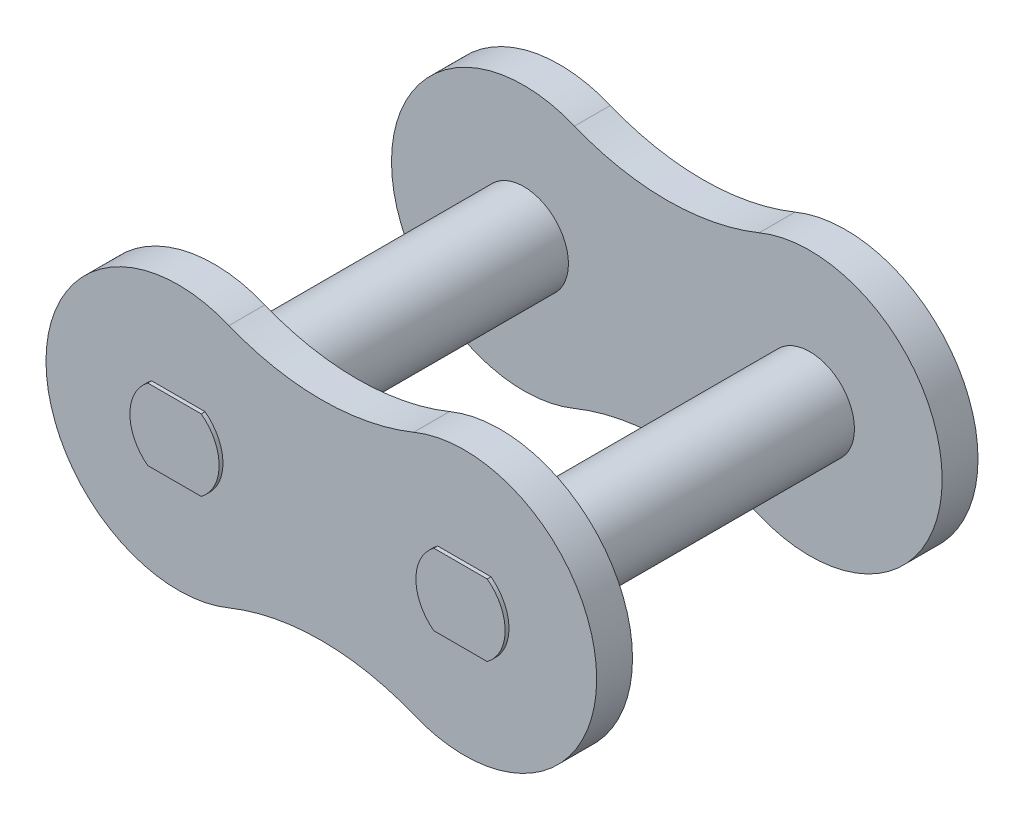
ISO-10303-21;
HEADER;
FILE_DESCRIPTION(('STEP AP214'),'2;1');
FILE_NAME('part.step','',(''),(''),'','','');
FILE_SCHEMA(('AUTOMOTIVE_DESIGN { 1 0 10303 214 1 1 1 1 }'));
ENDSEC;
DATA;
#1=APPLICATION_CONTEXT('core data for automotive mechanical design processes');
#2=APPLICATION_PROTOCOL_DEFINITION('international standard','automotive_design',2000,#1);
#3=PRODUCT_CONTEXT('',#1,'mechanical');
#4=PRODUCT('Part','Part','',(#3));
#5=PRODUCT_RELATED_PRODUCT_CATEGORY('part','',(#4));
#6=PRODUCT_DEFINITION_FORMATION('','',#4);
#7=PRODUCT_DEFINITION_CONTEXT('part definition',#1,'design');
#8=PRODUCT_DEFINITION('design','',#6,#7);
#9=PRODUCT_DEFINITION_SHAPE('','',#8);
#10=(LENGTH_UNIT() NAMED_UNIT(*) SI_UNIT(.MILLI.,.METRE.));
#11=(NAMED_UNIT(*) PLANE_ANGLE_UNIT() SI_UNIT($,.RADIAN.));
#12=(NAMED_UNIT(*) SI_UNIT($,.STERADIAN.) SOLID_ANGLE_UNIT());
#13=UNCERTAINTY_MEASURE_WITH_UNIT(LENGTH_MEASURE(1.E-05),#10,'distance_accuracy_value','');
#14=(GEOMETRIC_REPRESENTATION_CONTEXT(3) GLOBAL_UNCERTAINTY_ASSIGNED_CONTEXT((#13)) GLOBAL_UNIT_ASSIGNED_CONTEXT((#10,
#11,#12)) REPRESENTATION_CONTEXT('',''));
#15=CARTESIAN_POINT('',(0.,0.,0.));
#16=DIRECTION('',(0.,0.,1.));
#17=DIRECTION('',(1.,0.,0.));
#18=AXIS2_PLACEMENT_3D('',#15,#16,#17);
#19=CARTESIAN_POINT('',(0.,0.,0.));
#20=DIRECTION('',(0.,0.,1.));
#21=DIRECTION('',(1.,0.,0.));
#22=AXIS2_PLACEMENT_3D('',#19,#20,#21);
#23=PLANE('',#22);
#24=CARTESIAN_POINT('',(9.525,0.,0.));
#25=DIRECTION('',(0.,0.,1.));
#26=DIRECTION('',(1.,0.,0.));
#27=AXIS2_PLACEMENT_3D('',#24,#25,#26);
#28=CIRCLE('',#27,8.8138);
#29=CARTESIAN_POINT('',(6.15210476381968,-8.14288942364761,0.));
#30=VERTEX_POINT('',#29);
#31=CARTESIAN_POINT('',(6.15210476381968,8.14288942364761,0.));
#32=VERTEX_POINT('',#31);
#33=EDGE_CURVE('E352',#30,#32,#28,.T.);
#34=ORIENTED_EDGE('',*,*,#33,.F.);
#35=CARTESIAN_POINT('',(0.,-23.3328623999607,0.));
#36=DIRECTION('',(0.,0.,1.));
#37=DIRECTION('',(1.,0.,0.));
#38=AXIS2_PLACEMENT_3D('',#35,#36,#37);
#39=CIRCLE('',#38,16.3885225705716);
#40=CARTESIAN_POINT('',(-6.15210476382064,-8.14288942364801,0.));
#41=VERTEX_POINT('',#40);
#42=EDGE_CURVE('E357',#30,#41,#39,.T.);
#43=ORIENTED_EDGE('',*,*,#42,.T.);
#44=CARTESIAN_POINT('',(-9.525,0.,0.));
#45=DIRECTION('',(0.,0.,1.));
#46=DIRECTION('',(1.,0.,0.));
#47=AXIS2_PLACEMENT_3D('',#44,#45,#46);
#48=CIRCLE('',#47,8.8138);
#49=CARTESIAN_POINT('',(-6.15210476382064,8.14288942364801,0.));
#50=VERTEX_POINT('',#49);
#51=EDGE_CURVE('E375',#50,#41,#48,.T.);
#52=ORIENTED_EDGE('',*,*,#51,.F.);
#53=CARTESIAN_POINT('',(0.,23.3328623999607,0.));
#54=DIRECTION('',(0.,0.,1.));
#55=DIRECTION('',(1.,0.,0.));
#56=AXIS2_PLACEMENT_3D('',#53,#54,#55);
#57=CIRCLE('',#56,16.3885225705716);
#58=EDGE_CURVE('E373',#32,#50,#57,.F.);
#59=ORIENTED_EDGE('',*,*,#58,.F.);
#60=EDGE_LOOP('',(#34,#43,#52,#59));
#61=FACE_BOUND('',#60,.T.);
#62=CARTESIAN_POINT('',(-9.525,0.,0.));
#63=DIRECTION('',(0.,0.,1.));
#64=DIRECTION('',(1.,0.,0.));
#65=AXIS2_PLACEMENT_3D('',#62,#63,#64);
#66=CIRCLE('',#65,2.9718);
#67=CARTESIAN_POINT('',(-7.74701133932187,-2.38125,0.));
#68=VERTEX_POINT('',#67);
#69=CARTESIAN_POINT('',(-7.74701133932187,2.38125,0.));
#70=VERTEX_POINT('',#69);
#71=EDGE_CURVE('E246',#68,#70,#66,.T.);
#72=ORIENTED_EDGE('',*,*,#71,.T.);
#73=DIRECTION('',(-1.,0.,0.));
#74=VECTOR('',#73,1.);
#75=CARTESIAN_POINT('',(0.,2.38125,0.));
#76=LINE('',#75,#74);
#77=CARTESIAN_POINT('',(-11.3029886606781,2.38125,0.));
#78=VERTEX_POINT('',#77);
#79=EDGE_CURVE('E217',#70,#78,#76,.T.);
#80=ORIENTED_EDGE('',*,*,#79,.T.);
#81=CARTESIAN_POINT('',(-11.3029886606781,-2.38125,0.));
#82=VERTEX_POINT('',#81);
#83=EDGE_CURVE('E238',#78,#82,#66,.T.);
#84=ORIENTED_EDGE('',*,*,#83,.T.);
#85=DIRECTION('',(-1.,0.,0.));
#86=VECTOR('',#85,1.);
#87=CARTESIAN_POINT('',(0.,-2.38125,0.));
#88=LINE('',#87,#86);
#89=EDGE_CURVE('E57',#68,#82,#88,.T.);
#90=ORIENTED_EDGE('',*,*,#89,.F.);
#91=EDGE_LOOP('',(#72,#80,#84,#90));
#92=FACE_BOUND('',#91,.T.);
#93=DIRECTION('',(1.,0.,0.));
#94=VECTOR('',#93,1.);
#95=CARTESIAN_POINT('',(0.,2.38125,0.));
#96=LINE('',#95,#94);
#97=CARTESIAN_POINT('',(7.74701133932187,2.38125,0.));
#98=VERTEX_POINT('',#97);
#99=CARTESIAN_POINT('',(11.3029886606781,2.38125,0.));
#100=VERTEX_POINT('',#99);
#101=EDGE_CURVE('E213',#98,#100,#96,.T.);
#102=ORIENTED_EDGE('',*,*,#101,.F.);
#103=CARTESIAN_POINT('',(9.525,0.,0.));
#104=DIRECTION('',(0.,0.,1.));
#105=DIRECTION('',(1.,0.,0.));
#106=AXIS2_PLACEMENT_3D('',#103,#104,#105);
#107=CIRCLE('',#106,2.9718);
#108=CARTESIAN_POINT('',(7.74701133932187,-2.38125,0.));
#109=VERTEX_POINT('',#108);
#110=EDGE_CURVE('E207',#98,#109,#107,.T.);
#111=ORIENTED_EDGE('',*,*,#110,.T.);
#112=DIRECTION('',(1.,0.,0.));
#113=VECTOR('',#112,1.);
#114=CARTESIAN_POINT('',(0.,-2.38125,0.));
#115=LINE('',#114,#113);
#116=CARTESIAN_POINT('',(11.3029886606781,-2.38125,0.));
#117=VERTEX_POINT('',#116);
#118=EDGE_CURVE('E49',#109,#117,#115,.T.);
#119=ORIENTED_EDGE('',*,*,#118,.T.);
#120=EDGE_CURVE('E776',#117,#100,#107,.T.);
#121=ORIENTED_EDGE('',*,*,#120,.T.);
#122=EDGE_LOOP('',(#102,#111,#119,#121));
#123=FACE_BOUND('',#122,.T.);
#124=ADVANCED_FACE('F33',(#61,#92,#123),#23,.F.);
#125=CARTESIAN_POINT('',(-9.525,0.,25.4));
#126=DIRECTION('',(0.,0.,-1.));
#127=DIRECTION('',(-1.,0.,0.));
#128=AXIS2_PLACEMENT_3D('',#125,#126,#127);
#129=PLANE('',#128);
#130=CARTESIAN_POINT('',(9.525,0.,25.4));
#131=DIRECTION('',(0.,0.,1.));
#132=DIRECTION('',(1.,0.,0.));
#133=AXIS2_PLACEMENT_3D('',#130,#131,#132);
#134=CIRCLE('',#133,2.9718);
#135=CARTESIAN_POINT('',(7.74701133932187,2.38125,25.4));
#136=VERTEX_POINT('',#135);
#137=CARTESIAN_POINT('',(7.74701133932187,-2.38125,25.4));
#138=VERTEX_POINT('',#137);
#139=EDGE_CURVE('E269',#136,#138,#134,.T.);
#140=ORIENTED_EDGE('',*,*,#139,.F.);
#141=DIRECTION('',(1.,0.,0.));
#142=VECTOR('',#141,1.);
#143=CARTESIAN_POINT('',(0.,2.38125,25.4));
#144=LINE('',#143,#142);
#145=CARTESIAN_POINT('',(11.3029886606781,2.38125,25.4));
#146=VERTEX_POINT('',#145);
#147=EDGE_CURVE('E258',#136,#146,#144,.T.);
#148=ORIENTED_EDGE('',*,*,#147,.T.);
#149=CARTESIAN_POINT('',(11.3029886606781,-2.38125,25.4));
#150=VERTEX_POINT('',#149);
#151=EDGE_CURVE('E263',#150,#146,#134,.T.);
#152=ORIENTED_EDGE('',*,*,#151,.F.);
#153=DIRECTION('',(1.,0.,0.));
#154=VECTOR('',#153,1.);
#155=CARTESIAN_POINT('',(0.,-2.38125,25.4));
#156=LINE('',#155,#154);
#157=EDGE_CURVE('E272',#138,#150,#156,.T.);
#158=ORIENTED_EDGE('',*,*,#157,.F.);
#159=EDGE_LOOP('',(#140,#148,#152,#158));
#160=FACE_BOUND('',#159,.T.);
#161=CARTESIAN_POINT('',(0.,-23.3328623999607,25.4));
#162=DIRECTION('',(0.,0.,-1.));
#163=DIRECTION('',(1.,0.,0.));
#164=AXIS2_PLACEMENT_3D('',#161,#162,#163);
#165=CIRCLE('',#164,16.3885225705716);
#166=CARTESIAN_POINT('',(-6.15210476382064,-8.14288942364801,25.4));
#167=VERTEX_POINT('',#166);
#168=CARTESIAN_POINT('',(6.15210476381968,-8.14288942364761,25.4));
#169=VERTEX_POINT('',#168);
#170=EDGE_CURVE('E317',#167,#169,#165,.T.);
#171=ORIENTED_EDGE('',*,*,#170,.T.);
#172=CARTESIAN_POINT('',(9.525,0.,25.4));
#173=DIRECTION('',(0.,0.,1.));
#174=DIRECTION('',(1.,0.,0.));
#175=AXIS2_PLACEMENT_3D('',#172,#173,#174);
#176=CIRCLE('',#175,8.8138);
#177=CARTESIAN_POINT('',(6.15210476381967,8.1428894236476,25.4));
#178=VERTEX_POINT('',#177);
#179=EDGE_CURVE('E334',#169,#178,#176,.T.);
#180=ORIENTED_EDGE('',*,*,#179,.T.);
#181=CARTESIAN_POINT('',(0.,23.3328623999607,25.4));
#182=DIRECTION('',(0.,0.,-1.));
#183=DIRECTION('',(1.,0.,0.));
#184=AXIS2_PLACEMENT_3D('',#181,#182,#183);
#185=CIRCLE('',#184,16.3885225705716);
#186=CARTESIAN_POINT('',(-6.15210476382064,8.14288942364801,25.4));
#187=VERTEX_POINT('',#186);
#188=EDGE_CURVE('E337',#178,#187,#185,.T.);
#189=ORIENTED_EDGE('',*,*,#188,.T.);
#190=CARTESIAN_POINT('',(-9.525,0.,25.4));
#191=DIRECTION('',(0.,0.,1.));
#192=DIRECTION('',(1.,0.,0.));
#193=AXIS2_PLACEMENT_3D('',#190,#191,#192);
#194=CIRCLE('',#193,8.8138);
#195=EDGE_CURVE('E322',#187,#167,#194,.T.);
#196=ORIENTED_EDGE('',*,*,#195,.T.);
#197=EDGE_LOOP('',(#171,#180,#189,#196));
#198=FACE_BOUND('',#197,.T.);
#199=DIRECTION('',(-1.,0.,0.));
#200=VECTOR('',#199,1.);
#201=CARTESIAN_POINT('',(0.,2.38125,25.4));
#202=LINE('',#201,#200);
#203=CARTESIAN_POINT('',(-7.74701133932187,2.38125,25.4));
#204=VERTEX_POINT('',#203);
#205=CARTESIAN_POINT('',(-11.3029886606781,2.38125,25.4));
#206=VERTEX_POINT('',#205);
#207=EDGE_CURVE('E287',#204,#206,#202,.T.);
#208=ORIENTED_EDGE('',*,*,#207,.F.);
#209=CARTESIAN_POINT('',(-9.525,0.,25.4));
#210=DIRECTION('',(0.,0.,1.));
#211=DIRECTION('',(1.,0.,0.));
#212=AXIS2_PLACEMENT_3D('',#209,#210,#211);
#213=CIRCLE('',#212,2.9718);
#214=CARTESIAN_POINT('',(-7.74701133932187,-2.38125,25.4));
#215=VERTEX_POINT('',#214);
#216=EDGE_CURVE('E292',#215,#204,#213,.T.);
#217=ORIENTED_EDGE('',*,*,#216,.F.);
#218=DIRECTION('',(-1.,0.,0.));
#219=VECTOR('',#218,1.);
#220=CARTESIAN_POINT('',(0.,-2.38125,25.4));
#221=LINE('',#220,#219);
#222=CARTESIAN_POINT('',(-11.3029886606781,-2.38125,25.4));
#223=VERTEX_POINT('',#222);
#224=EDGE_CURVE('E303',#215,#223,#221,.T.);
#225=ORIENTED_EDGE('',*,*,#224,.T.);
#226=EDGE_CURVE('E300',#206,#223,#213,.T.);
#227=ORIENTED_EDGE('',*,*,#226,.F.);
#228=EDGE_LOOP('',(#208,#217,#225,#227));
#229=FACE_BOUND('',#228,.T.);
#230=ADVANCED_FACE('F415',(#160,#198,#229),#129,.F.);
#231=CARTESIAN_POINT('',(-9.525,0.,25.4));
#232=DIRECTION('',(0.,0.,-1.));
#233=DIRECTION('',(-1.,0.,0.));
#234=AXIS2_PLACEMENT_3D('',#231,#232,#233);
#235=CYLINDRICAL_SURFACE('',#234,2.9718);
#236=CARTESIAN_POINT('',(-9.525,0.,2.3876));
#237=DIRECTION('',(0.,0.,1.));
#238=DIRECTION('',(1.,0.,0.));
#239=AXIS2_PLACEMENT_3D('',#236,#237,#238);
#240=CIRCLE('',#239,2.9718);
#241=CARTESIAN_POINT('',(-6.5532,0.,2.3876));
#242=VERTEX_POINT('',#241);
#243=EDGE_CURVE('E364',#242,#242,#240,.T.);
#244=ORIENTED_EDGE('',*,*,#243,.T.);
#245=EDGE_LOOP('',(#244));
#246=FACE_BOUND('',#245,.T.);
#247=CARTESIAN_POINT('',(-9.525,0.,23.0124));
#248=DIRECTION('',(0.,0.,1.));
#249=DIRECTION('',(1.,0.,0.));
#250=AXIS2_PLACEMENT_3D('',#247,#248,#249);
#251=CIRCLE('',#250,2.9718);
#252=CARTESIAN_POINT('',(-6.5532,0.,23.0124));
#253=VERTEX_POINT('',#252);
#254=EDGE_CURVE('E349',#253,#253,#251,.F.);
#255=ORIENTED_EDGE('',*,*,#254,.T.);
#256=EDGE_LOOP('',(#255));
#257=FACE_BOUND('',#256,.T.);
#258=ADVANCED_FACE('F411',(#246,#257),#235,.T.);
#259=CARTESIAN_POINT('',(9.525,0.,25.4));
#260=DIRECTION('',(0.,0.,-1.));
#261=DIRECTION('',(-1.,0.,0.));
#262=AXIS2_PLACEMENT_3D('',#259,#260,#261);
#263=CYLINDRICAL_SURFACE('',#262,2.9718);
#264=CARTESIAN_POINT('',(9.525,0.,2.3876));
#265=DIRECTION('',(0.,0.,1.));
#266=DIRECTION('',(1.,0.,0.));
#267=AXIS2_PLACEMENT_3D('',#264,#265,#266);
#268=CIRCLE('',#267,2.9718);
#269=CARTESIAN_POINT('',(12.4968,0.,2.3876));
#270=VERTEX_POINT('',#269);
#271=EDGE_CURVE('E367',#270,#270,#268,.T.);
#272=ORIENTED_EDGE('',*,*,#271,.T.);
#273=EDGE_LOOP('',(#272));
#274=FACE_BOUND('',#273,.T.);
#275=CARTESIAN_POINT('',(9.525,0.,23.0124));
#276=DIRECTION('',(0.,0.,1.));
#277=DIRECTION('',(1.,0.,0.));
#278=AXIS2_PLACEMENT_3D('',#275,#276,#277);
#279=CIRCLE('',#278,2.9718);
#280=CARTESIAN_POINT('',(12.4968,0.,23.0124));
#281=VERTEX_POINT('',#280);
#282=EDGE_CURVE('E37',#281,#281,#279,.F.);
#283=ORIENTED_EDGE('',*,*,#282,.T.);
#284=EDGE_LOOP('',(#283));
#285=FACE_BOUND('',#284,.T.);
#286=ADVANCED_FACE('F406',(#274,#285),#263,.T.);
#287=CARTESIAN_POINT('',(9.525,0.,2.3876));
#288=DIRECTION('',(0.,0.,-1.));
#289=DIRECTION('',(-1.,0.,0.));
#290=AXIS2_PLACEMENT_3D('',#287,#288,#289);
#291=CYLINDRICAL_SURFACE('',#290,8.8138);
#292=ORIENTED_EDGE('',*,*,#33,.T.);
#293=DIRECTION('',(0.,0.,-1.));
#294=VECTOR('',#293,1.);
#295=CARTESIAN_POINT('',(6.15210476381968,8.14288942364761,2.3876));
#296=LINE('',#295,#294);
#297=CARTESIAN_POINT('',(6.15210476381968,8.14288942364761,2.3876));
#298=VERTEX_POINT('',#297);
#299=EDGE_CURVE('E11',#298,#32,#296,.T.);
#300=ORIENTED_EDGE('',*,*,#299,.F.);
#301=CARTESIAN_POINT('',(9.525,0.,2.3876));
#302=DIRECTION('',(0.,0.,1.));
#303=DIRECTION('',(1.,0.,0.));
#304=AXIS2_PLACEMENT_3D('',#301,#302,#303);
#305=CIRCLE('',#304,8.8138);
#306=CARTESIAN_POINT('',(6.15210476381968,-8.14288942364761,2.3876));
#307=VERTEX_POINT('',#306);
#308=EDGE_CURVE('E353',#307,#298,#305,.T.);
#309=ORIENTED_EDGE('',*,*,#308,.F.);
#310=DIRECTION('',(0.,0.,-1.));
#311=VECTOR('',#310,1.);
#312=CARTESIAN_POINT('',(6.15210476381968,-8.14288942364761,2.3876));
#313=LINE('',#312,#311);
#314=EDGE_CURVE('E370',#307,#30,#313,.T.);
#315=ORIENTED_EDGE('',*,*,#314,.T.);
#316=EDGE_LOOP('',(#292,#300,#309,#315));
#317=FACE_BOUND('',#316,.T.);
#318=ADVANCED_FACE('F35',(#317),#291,.T.);
#319=CARTESIAN_POINT('',(0.,23.3328623999607,2.3876));
#320=DIRECTION('',(0.,0.,-1.));
#321=DIRECTION('',(-1.,0.,0.));
#322=AXIS2_PLACEMENT_3D('',#319,#320,#321);
#323=CYLINDRICAL_SURFACE('',#322,16.3885225705716);
#324=ORIENTED_EDGE('',*,*,#58,.T.);
#325=DIRECTION('',(0.,0.,-1.));
#326=VECTOR('',#325,1.);
#327=CARTESIAN_POINT('',(-6.15210476382064,8.14288942364801,2.3876));
#328=LINE('',#327,#326);
#329=CARTESIAN_POINT('',(-6.15210476382064,8.14288942364801,2.3876));
#330=VERTEX_POINT('',#329);
#331=EDGE_CURVE('E42',#330,#50,#328,.T.);
#332=ORIENTED_EDGE('',*,*,#331,.F.);
#333=CARTESIAN_POINT('',(0.,23.3328623999607,2.3876));
#334=DIRECTION('',(0.,0.,1.));
#335=DIRECTION('',(1.,0.,0.));
#336=AXIS2_PLACEMENT_3D('',#333,#334,#335);
#337=CIRCLE('',#336,16.3885225705716);
#338=EDGE_CURVE('E356',#298,#330,#337,.F.);
#339=ORIENTED_EDGE('',*,*,#338,.F.);
#340=ORIENTED_EDGE('',*,*,#299,.T.);
#341=EDGE_LOOP('',(#324,#332,#339,#340));
#342=FACE_BOUND('',#341,.T.);
#343=ADVANCED_FACE('F403',(#342),#323,.F.);
#344=CARTESIAN_POINT('',(-9.525,0.,2.3876));
#345=DIRECTION('',(0.,0.,-1.));
#346=DIRECTION('',(-1.,0.,0.));
#347=AXIS2_PLACEMENT_3D('',#344,#345,#346);
#348=CYLINDRICAL_SURFACE('',#347,8.8138);
#349=ORIENTED_EDGE('',*,*,#51,.T.);
#350=DIRECTION('',(0.,0.,-1.));
#351=VECTOR('',#350,1.);
#352=CARTESIAN_POINT('',(-6.15210476382064,-8.14288942364801,2.3876));
#353=LINE('',#352,#351);
#354=CARTESIAN_POINT('',(-6.15210476382064,-8.14288942364801,2.3876));
#355=VERTEX_POINT('',#354);
#356=EDGE_CURVE('E381',#355,#41,#353,.T.);
#357=ORIENTED_EDGE('',*,*,#356,.F.);
#358=CARTESIAN_POINT('',(-9.525,0.,2.3876));
#359=DIRECTION('',(0.,0.,1.));
#360=DIRECTION('',(1.,0.,0.));
#361=AXIS2_PLACEMENT_3D('',#358,#359,#360);
#362=CIRCLE('',#361,8.8138);
#363=EDGE_CURVE('E359',#330,#355,#362,.T.);
#364=ORIENTED_EDGE('',*,*,#363,.F.);
#365=ORIENTED_EDGE('',*,*,#331,.T.);
#366=EDGE_LOOP('',(#349,#357,#364,#365));
#367=FACE_BOUND('',#366,.T.);
#368=ADVANCED_FACE('F388',(#367),#348,.T.);
#369=CARTESIAN_POINT('',(0.,-23.3328623999607,2.3876));
#370=DIRECTION('',(0.,0.,-1.));
#371=DIRECTION('',(-1.,0.,0.));
#372=AXIS2_PLACEMENT_3D('',#369,#370,#371);
#373=CYLINDRICAL_SURFACE('',#372,16.3885225705716);
#374=ORIENTED_EDGE('',*,*,#42,.F.);
#375=ORIENTED_EDGE('',*,*,#314,.F.);
#376=CARTESIAN_POINT('',(0.,-23.3328623999607,2.3876));
#377=DIRECTION('',(0.,0.,1.));
#378=DIRECTION('',(1.,0.,0.));
#379=AXIS2_PLACEMENT_3D('',#376,#377,#378);
#380=CIRCLE('',#379,16.3885225705716);
#381=EDGE_CURVE('E361',#307,#355,#380,.T.);
#382=ORIENTED_EDGE('',*,*,#381,.T.);
#383=ORIENTED_EDGE('',*,*,#356,.T.);
#384=EDGE_LOOP('',(#374,#375,#382,#383));
#385=FACE_BOUND('',#384,.T.);
#386=ADVANCED_FACE('F396',(#385),#373,.F.);
#387=CARTESIAN_POINT('',(0.,0.,2.3876));
#388=DIRECTION('',(0.,0.,1.));
#389=DIRECTION('',(1.,0.,0.));
#390=AXIS2_PLACEMENT_3D('',#387,#388,#389);
#391=PLANE('',#390);
#392=ORIENTED_EDGE('',*,*,#308,.T.);
#393=ORIENTED_EDGE('',*,*,#338,.T.);
#394=ORIENTED_EDGE('',*,*,#363,.T.);
#395=ORIENTED_EDGE('',*,*,#381,.F.);
#396=EDGE_LOOP('',(#392,#393,#394,#395));
#397=FACE_BOUND('',#396,.T.);
#398=ORIENTED_EDGE('',*,*,#243,.F.);
#399=EDGE_LOOP('',(#398));
#400=FACE_BOUND('',#399,.T.);
#401=ORIENTED_EDGE('',*,*,#271,.F.);
#402=EDGE_LOOP('',(#401));
#403=FACE_BOUND('',#402,.T.);
#404=ADVANCED_FACE('F400',(#397,#400,#403),#391,.T.);
#405=CARTESIAN_POINT('',(0.,-23.3328623999607,23.0124));
#406=DIRECTION('',(0.,0.,1.));
#407=DIRECTION('',(1.,0.,0.));
#408=AXIS2_PLACEMENT_3D('',#405,#406,#407);
#409=CYLINDRICAL_SURFACE('',#408,16.3885225705716);
#410=ORIENTED_EDGE('',*,*,#170,.F.);
#411=DIRECTION('',(0.,0.,1.));
#412=VECTOR('',#411,1.);
#413=CARTESIAN_POINT('',(-6.15210476382064,-8.14288942364801,23.0124));
#414=LINE('',#413,#412);
#415=CARTESIAN_POINT('',(-6.15210476382064,-8.14288942364801,23.0124));
#416=VERTEX_POINT('',#415);
#417=EDGE_CURVE('E342',#416,#167,#414,.T.);
#418=ORIENTED_EDGE('',*,*,#417,.F.);
#419=CARTESIAN_POINT('',(0.,-23.3328623999607,23.0124));
#420=DIRECTION('',(0.,0.,-1.));
#421=DIRECTION('',(1.,0.,0.));
#422=AXIS2_PLACEMENT_3D('',#419,#420,#421);
#423=CIRCLE('',#422,16.3885225705716);
#424=CARTESIAN_POINT('',(6.15210476381968,-8.14288942364761,23.0124));
#425=VERTEX_POINT('',#424);
#426=EDGE_CURVE('E318',#416,#425,#423,.T.);
#427=ORIENTED_EDGE('',*,*,#426,.T.);
#428=DIRECTION('',(0.,0.,1.));
#429=VECTOR('',#428,1.);
#430=CARTESIAN_POINT('',(6.15210476381968,-8.14288942364761,23.0124));
#431=LINE('',#430,#429);
#432=EDGE_CURVE('E331',#425,#169,#431,.T.);
#433=ORIENTED_EDGE('',*,*,#432,.T.);
#434=EDGE_LOOP('',(#410,#418,#427,#433));
#435=FACE_BOUND('',#434,.T.);
#436=ADVANCED_FACE('F444',(#435),#409,.F.);
#437=CARTESIAN_POINT('',(-9.525,0.,23.0124));
#438=DIRECTION('',(0.,0.,1.));
#439=DIRECTION('',(1.,0.,0.));
#440=AXIS2_PLACEMENT_3D('',#437,#438,#439);
#441=CYLINDRICAL_SURFACE('',#440,8.8138);
#442=ORIENTED_EDGE('',*,*,#195,.F.);
#443=DIRECTION('',(0.,0.,1.));
#444=VECTOR('',#443,1.);
#445=CARTESIAN_POINT('',(-6.15210476382064,8.14288942364801,23.0124));
#446=LINE('',#445,#444);
#447=CARTESIAN_POINT('',(-6.15210476382064,8.14288942364801,23.0124));
#448=VERTEX_POINT('',#447);
#449=EDGE_CURVE('E344',#448,#187,#446,.T.);
#450=ORIENTED_EDGE('',*,*,#449,.F.);
#451=CARTESIAN_POINT('',(-9.525,0.,23.0124));
#452=DIRECTION('',(0.,0.,1.));
#453=DIRECTION('',(1.,0.,0.));
#454=AXIS2_PLACEMENT_3D('',#451,#452,#453);
#455=CIRCLE('',#454,8.8138);
#456=EDGE_CURVE('E328',#448,#416,#455,.T.);
#457=ORIENTED_EDGE('',*,*,#456,.T.);
#458=ORIENTED_EDGE('',*,*,#417,.T.);
#459=EDGE_LOOP('',(#442,#450,#457,#458));
#460=FACE_BOUND('',#459,.T.);
#461=ADVANCED_FACE('F451',(#460),#441,.T.);
#462=CARTESIAN_POINT('',(0.,23.3328623999607,23.0124));
#463=DIRECTION('',(0.,0.,1.));
#464=DIRECTION('',(1.,0.,0.));
#465=AXIS2_PLACEMENT_3D('',#462,#463,#464);
#466=CYLINDRICAL_SURFACE('',#465,16.3885225705716);
#467=ORIENTED_EDGE('',*,*,#188,.F.);
#468=DIRECTION('',(0.,0.,1.));
#469=VECTOR('',#468,1.);
#470=CARTESIAN_POINT('',(6.15210476381967,8.1428894236476,23.0124));
#471=LINE('',#470,#469);
#472=CARTESIAN_POINT('',(6.15210476381967,8.1428894236476,23.0124));
#473=VERTEX_POINT('',#472);
#474=EDGE_CURVE('E346',#473,#178,#471,.T.);
#475=ORIENTED_EDGE('',*,*,#474,.F.);
#476=CARTESIAN_POINT('',(0.,23.3328623999607,23.0124));
#477=DIRECTION('',(0.,0.,-1.));
#478=DIRECTION('',(1.,0.,0.));
#479=AXIS2_PLACEMENT_3D('',#476,#477,#478);
#480=CIRCLE('',#479,16.3885225705716);
#481=EDGE_CURVE('E325',#473,#448,#480,.T.);
#482=ORIENTED_EDGE('',*,*,#481,.T.);
#483=ORIENTED_EDGE('',*,*,#449,.T.);
#484=EDGE_LOOP('',(#467,#475,#482,#483));
#485=FACE_BOUND('',#484,.T.);
#486=ADVANCED_FACE('F460',(#485),#466,.F.);
#487=CARTESIAN_POINT('',(9.525,0.,23.0124));
#488=DIRECTION('',(0.,0.,1.));
#489=DIRECTION('',(1.,0.,0.));
#490=AXIS2_PLACEMENT_3D('',#487,#488,#489);
#491=CYLINDRICAL_SURFACE('',#490,8.8138);
#492=ORIENTED_EDGE('',*,*,#179,.F.);
#493=ORIENTED_EDGE('',*,*,#432,.F.);
#494=CARTESIAN_POINT('',(9.525,0.,23.0124));
#495=DIRECTION('',(0.,0.,1.));
#496=DIRECTION('',(1.,0.,0.));
#497=AXIS2_PLACEMENT_3D('',#494,#495,#496);
#498=CIRCLE('',#497,8.8138);
#499=EDGE_CURVE('E321',#425,#473,#498,.T.);
#500=ORIENTED_EDGE('',*,*,#499,.T.);
#501=ORIENTED_EDGE('',*,*,#474,.T.);
#502=EDGE_LOOP('',(#492,#493,#500,#501));
#503=FACE_BOUND('',#502,.T.);
#504=ADVANCED_FACE('F468',(#503),#491,.T.);
#505=CARTESIAN_POINT('',(-4.7625,-11.6664311999803,23.0124));
#506=DIRECTION('',(0.,0.,1.));
#507=DIRECTION('',(1.,0.,0.));
#508=AXIS2_PLACEMENT_3D('',#505,#506,#507);
#509=PLANE('',#508);
#510=ORIENTED_EDGE('',*,*,#254,.F.);
#511=EDGE_LOOP('',(#510));
#512=FACE_BOUND('',#511,.T.);
#513=ORIENTED_EDGE('',*,*,#282,.F.);
#514=EDGE_LOOP('',(#513));
#515=FACE_BOUND('',#514,.T.);
#516=ORIENTED_EDGE('',*,*,#426,.F.);
#517=ORIENTED_EDGE('',*,*,#456,.F.);
#518=ORIENTED_EDGE('',*,*,#481,.F.);
#519=ORIENTED_EDGE('',*,*,#499,.F.);
#520=EDGE_LOOP('',(#516,#517,#518,#519));
#521=FACE_BOUND('',#520,.T.);
#522=ADVANCED_FACE('F476',(#512,#515,#521),#509,.F.);
#523=CARTESIAN_POINT('',(0.,2.38125,25.654));
#524=DIRECTION('',(0.,-1.,0.));
#525=DIRECTION('',(1.,0.,0.));
#526=AXIS2_PLACEMENT_3D('',#523,#524,#525);
#527=PLANE('',#526);
#528=ORIENTED_EDGE('',*,*,#207,.T.);
#529=DIRECTION('',(0.,0.,-1.));
#530=VECTOR('',#529,1.);
#531=CARTESIAN_POINT('',(-11.3029886606781,2.38125,25.654));
#532=LINE('',#531,#530);
#533=CARTESIAN_POINT('',(-11.3029886606781,2.38125,25.654));
#534=VERTEX_POINT('',#533);
#535=EDGE_CURVE('E314',#534,#206,#532,.T.);
#536=ORIENTED_EDGE('',*,*,#535,.F.);
#537=DIRECTION('',(-1.,0.,0.));
#538=VECTOR('',#537,1.);
#539=CARTESIAN_POINT('',(0.,2.38125,25.654));
#540=LINE('',#539,#538);
#541=CARTESIAN_POINT('',(-7.74701133932187,2.38125,25.654));
#542=VERTEX_POINT('',#541);
#543=EDGE_CURVE('E288',#542,#534,#540,.T.);
#544=ORIENTED_EDGE('',*,*,#543,.F.);
#545=DIRECTION('',(0.,0.,-1.));
#546=VECTOR('',#545,1.);
#547=CARTESIAN_POINT('',(-7.74701133932187,2.38125,25.654));
#548=LINE('',#547,#546);
#549=EDGE_CURVE('E305',#542,#204,#548,.T.);
#550=ORIENTED_EDGE('',*,*,#549,.T.);
#551=EDGE_LOOP('',(#528,#536,#544,#550));
#552=FACE_BOUND('',#551,.T.);
#553=ADVANCED_FACE('F484',(#552),#527,.F.);
#554=CARTESIAN_POINT('',(-9.525,0.,25.654));
#555=DIRECTION('',(0.,0.,-1.));
#556=DIRECTION('',(-1.,0.,0.));
#557=AXIS2_PLACEMENT_3D('',#554,#555,#556);
#558=CYLINDRICAL_SURFACE('',#557,2.9718);
#559=ORIENTED_EDGE('',*,*,#226,.T.);
#560=DIRECTION('',(0.,0.,-1.));
#561=VECTOR('',#560,1.);
#562=CARTESIAN_POINT('',(-11.3029886606781,-2.38125,25.654));
#563=LINE('',#562,#561);
#564=CARTESIAN_POINT('',(-11.3029886606781,-2.38125,25.654));
#565=VERTEX_POINT('',#564);
#566=EDGE_CURVE('E311',#565,#223,#563,.T.);
#567=ORIENTED_EDGE('',*,*,#566,.F.);
#568=CARTESIAN_POINT('',(-9.525,0.,25.654));
#569=DIRECTION('',(0.,0.,1.));
#570=DIRECTION('',(1.,0.,0.));
#571=AXIS2_PLACEMENT_3D('',#568,#569,#570);
#572=CIRCLE('',#571,2.9718);
#573=EDGE_CURVE('E291',#534,#565,#572,.T.);
#574=ORIENTED_EDGE('',*,*,#573,.F.);
#575=ORIENTED_EDGE('',*,*,#535,.T.);
#576=EDGE_LOOP('',(#559,#567,#574,#575));
#577=FACE_BOUND('',#576,.T.);
#578=ADVANCED_FACE('F505',(#577),#558,.T.);
#579=CARTESIAN_POINT('',(0.,-2.38125,25.654));
#580=DIRECTION('',(0.,-1.,0.));
#581=DIRECTION('',(1.,0.,0.));
#582=AXIS2_PLACEMENT_3D('',#579,#580,#581);
#583=PLANE('',#582);
#584=ORIENTED_EDGE('',*,*,#224,.F.);
#585=DIRECTION('',(0.,0.,-1.));
#586=VECTOR('',#585,1.);
#587=CARTESIAN_POINT('',(-7.74701133932187,-2.38125,25.654));
#588=LINE('',#587,#586);
#589=CARTESIAN_POINT('',(-7.74701133932187,-2.38125,25.654));
#590=VERTEX_POINT('',#589);
#591=EDGE_CURVE('E308',#590,#215,#588,.T.);
#592=ORIENTED_EDGE('',*,*,#591,.F.);
#593=DIRECTION('',(-1.,0.,0.));
#594=VECTOR('',#593,1.);
#595=CARTESIAN_POINT('',(0.,-2.38125,25.654));
#596=LINE('',#595,#594);
#597=EDGE_CURVE('E294',#590,#565,#596,.T.);
#598=ORIENTED_EDGE('',*,*,#597,.T.);
#599=ORIENTED_EDGE('',*,*,#566,.T.);
#600=EDGE_LOOP('',(#584,#592,#598,#599));
#601=FACE_BOUND('',#600,.T.);
#602=ADVANCED_FACE('F513',(#601),#583,.T.);
#603=ORIENTED_EDGE('',*,*,#216,.T.);
#604=ORIENTED_EDGE('',*,*,#549,.F.);
#605=EDGE_CURVE('E295',#590,#542,#572,.T.);
#606=ORIENTED_EDGE('',*,*,#605,.F.);
#607=ORIENTED_EDGE('',*,*,#591,.T.);
#608=EDGE_LOOP('',(#603,#604,#606,#607));
#609=FACE_BOUND('',#608,.T.);
#610=ADVANCED_FACE('F516',(#609),#558,.T.);
#611=CARTESIAN_POINT('',(0.,0.,25.654));
#612=DIRECTION('',(0.,0.,1.));
#613=DIRECTION('',(1.,0.,0.));
#614=AXIS2_PLACEMENT_3D('',#611,#612,#613);
#615=PLANE('',#614);
#616=ORIENTED_EDGE('',*,*,#543,.T.);
#617=ORIENTED_EDGE('',*,*,#573,.T.);
#618=ORIENTED_EDGE('',*,*,#597,.F.);
#619=ORIENTED_EDGE('',*,*,#605,.T.);
#620=EDGE_LOOP('',(#616,#617,#618,#619));
#621=FACE_BOUND('',#620,.T.);
#622=ADVANCED_FACE('F529',(#621),#615,.T.);
#623=CARTESIAN_POINT('',(0.,2.38125,25.654));
#624=DIRECTION('',(0.,1.,0.));
#625=DIRECTION('',(-1.,0.,0.));
#626=AXIS2_PLACEMENT_3D('',#623,#624,#625);
#627=PLANE('',#626);
#628=ORIENTED_EDGE('',*,*,#147,.F.);
#629=DIRECTION('',(0.,0.,-1.));
#630=VECTOR('',#629,1.);
#631=CARTESIAN_POINT('',(7.74701133932187,2.38125,25.654));
#632=LINE('',#631,#630);
#633=CARTESIAN_POINT('',(7.74701133932187,2.38125,25.654));
#634=VERTEX_POINT('',#633);
#635=EDGE_CURVE('E284',#634,#136,#632,.T.);
#636=ORIENTED_EDGE('',*,*,#635,.F.);
#637=DIRECTION('',(1.,0.,0.));
#638=VECTOR('',#637,1.);
#639=CARTESIAN_POINT('',(0.,2.38125,25.654));
#640=LINE('',#639,#638);
#641=CARTESIAN_POINT('',(11.3029886606781,2.38125,25.654));
#642=VERTEX_POINT('',#641);
#643=EDGE_CURVE('E259',#634,#642,#640,.T.);
#644=ORIENTED_EDGE('',*,*,#643,.T.);
#645=DIRECTION('',(0.,0.,-1.));
#646=VECTOR('',#645,1.);
#647=CARTESIAN_POINT('',(11.3029886606781,2.38125,25.654));
#648=LINE('',#647,#646);
#649=EDGE_CURVE('E275',#642,#146,#648,.T.);
#650=ORIENTED_EDGE('',*,*,#649,.T.);
#651=EDGE_LOOP('',(#628,#636,#644,#650));
#652=FACE_BOUND('',#651,.T.);
#653=ADVANCED_FACE('F536',(#652),#627,.T.);
#654=CARTESIAN_POINT('',(9.525,0.,25.654));
#655=DIRECTION('',(0.,0.,-1.));
#656=DIRECTION('',(-1.,0.,0.));
#657=AXIS2_PLACEMENT_3D('',#654,#655,#656);
#658=CYLINDRICAL_SURFACE('',#657,2.9718);
#659=ORIENTED_EDGE('',*,*,#139,.T.);
#660=DIRECTION('',(0.,0.,-1.));
#661=VECTOR('',#660,1.);
#662=CARTESIAN_POINT('',(7.74701133932187,-2.38125,25.654));
#663=LINE('',#662,#661);
#664=CARTESIAN_POINT('',(7.74701133932187,-2.38125,25.654));
#665=VERTEX_POINT('',#664);
#666=EDGE_CURVE('E281',#665,#138,#663,.T.);
#667=ORIENTED_EDGE('',*,*,#666,.F.);
#668=CARTESIAN_POINT('',(9.525,0.,25.654));
#669=DIRECTION('',(0.,0.,1.));
#670=DIRECTION('',(1.,0.,0.));
#671=AXIS2_PLACEMENT_3D('',#668,#669,#670);
#672=CIRCLE('',#671,2.9718);
#673=EDGE_CURVE('E262',#634,#665,#672,.T.);
#674=ORIENTED_EDGE('',*,*,#673,.F.);
#675=ORIENTED_EDGE('',*,*,#635,.T.);
#676=EDGE_LOOP('',(#659,#667,#674,#675));
#677=FACE_BOUND('',#676,.T.);
#678=ADVANCED_FACE('F544',(#677),#658,.T.);
#679=CARTESIAN_POINT('',(0.,-2.38125,25.654));
#680=DIRECTION('',(0.,1.,0.));
#681=DIRECTION('',(-1.,0.,0.));
#682=AXIS2_PLACEMENT_3D('',#679,#680,#681);
#683=PLANE('',#682);
#684=ORIENTED_EDGE('',*,*,#157,.T.);
#685=DIRECTION('',(0.,0.,-1.));
#686=VECTOR('',#685,1.);
#687=CARTESIAN_POINT('',(11.3029886606781,-2.38125,25.654));
#688=LINE('',#687,#686);
#689=CARTESIAN_POINT('',(11.3029886606781,-2.38125,25.654));
#690=VERTEX_POINT('',#689);
#691=EDGE_CURVE('E278',#690,#150,#688,.T.);
#692=ORIENTED_EDGE('',*,*,#691,.F.);
#693=DIRECTION('',(1.,0.,0.));
#694=VECTOR('',#693,1.);
#695=CARTESIAN_POINT('',(0.,-2.38125,25.654));
#696=LINE('',#695,#694);
#697=EDGE_CURVE('E265',#665,#690,#696,.T.);
#698=ORIENTED_EDGE('',*,*,#697,.F.);
#699=ORIENTED_EDGE('',*,*,#666,.T.);
#700=EDGE_LOOP('',(#684,#692,#698,#699));
#701=FACE_BOUND('',#700,.T.);
#702=ADVANCED_FACE('F552',(#701),#683,.F.);
#703=ORIENTED_EDGE('',*,*,#151,.T.);
#704=ORIENTED_EDGE('',*,*,#649,.F.);
#705=EDGE_CURVE('E266',#690,#642,#672,.T.);
#706=ORIENTED_EDGE('',*,*,#705,.F.);
#707=ORIENTED_EDGE('',*,*,#691,.T.);
#708=EDGE_LOOP('',(#703,#704,#706,#707));
#709=FACE_BOUND('',#708,.T.);
#710=ADVANCED_FACE('F555',(#709),#658,.T.);
#711=CARTESIAN_POINT('',(0.,0.,25.654));
#712=DIRECTION('',(0.,0.,1.));
#713=DIRECTION('',(1.,0.,0.));
#714=AXIS2_PLACEMENT_3D('',#711,#712,#713);
#715=PLANE('',#714);
#716=ORIENTED_EDGE('',*,*,#643,.F.);
#717=ORIENTED_EDGE('',*,*,#673,.T.);
#718=ORIENTED_EDGE('',*,*,#697,.T.);
#719=ORIENTED_EDGE('',*,*,#705,.T.);
#720=EDGE_LOOP('',(#716,#717,#718,#719));
#721=FACE_BOUND('',#720,.T.);
#722=ADVANCED_FACE('F568',(#721),#715,.T.);
#723=CARTESIAN_POINT('',(0.,2.38125,-0.254));
#724=DIRECTION('',(0.,1.,0.));
#725=DIRECTION('',(-1.,0.,0.));
#726=AXIS2_PLACEMENT_3D('',#723,#724,#725);
#727=PLANE('',#726);
#728=ORIENTED_EDGE('',*,*,#79,.F.);
#729=DIRECTION('',(0.,0.,1.));
#730=VECTOR('',#729,1.);
#731=CARTESIAN_POINT('',(-7.74701133932187,2.38125,-0.254));
#732=LINE('',#731,#730);
#733=CARTESIAN_POINT('',(-7.74701133932187,2.38125,-0.254));
#734=VERTEX_POINT('',#733);
#735=EDGE_CURVE('E256',#734,#70,#732,.T.);
#736=ORIENTED_EDGE('',*,*,#735,.F.);
#737=DIRECTION('',(-1.,0.,0.));
#738=VECTOR('',#737,1.);
#739=CARTESIAN_POINT('',(0.,2.38125,-0.254));
#740=LINE('',#739,#738);
#741=CARTESIAN_POINT('',(-11.3029886606781,2.38125,-0.254));
#742=VERTEX_POINT('',#741);
#743=EDGE_CURVE('E234',#734,#742,#740,.T.);
#744=ORIENTED_EDGE('',*,*,#743,.T.);
#745=DIRECTION('',(0.,0.,1.));
#746=VECTOR('',#745,1.);
#747=CARTESIAN_POINT('',(-11.3029886606781,2.38125,-0.254));
#748=LINE('',#747,#746);
#749=EDGE_CURVE('E250',#742,#78,#748,.T.);
#750=ORIENTED_EDGE('',*,*,#749,.T.);
#751=EDGE_LOOP('',(#728,#736,#744,#750));
#752=FACE_BOUND('',#751,.T.);
#753=ADVANCED_FACE('F574',(#752),#727,.T.);
#754=CARTESIAN_POINT('',(-9.525,0.,-0.254));
#755=DIRECTION('',(0.,0.,1.));
#756=DIRECTION('',(1.,0.,0.));
#757=AXIS2_PLACEMENT_3D('',#754,#755,#756);
#758=CYLINDRICAL_SURFACE('',#757,2.9718);
#759=ORIENTED_EDGE('',*,*,#71,.F.);
#760=DIRECTION('',(0.,0.,1.));
#761=VECTOR('',#760,1.);
#762=CARTESIAN_POINT('',(-7.74701133932187,-2.38125,-0.254));
#763=LINE('',#762,#761);
#764=CARTESIAN_POINT('',(-7.74701133932187,-2.38125,-0.254));
#765=VERTEX_POINT('',#764);
#766=EDGE_CURVE('E254',#765,#68,#763,.T.);
#767=ORIENTED_EDGE('',*,*,#766,.F.);
#768=CARTESIAN_POINT('',(-9.525,0.,-0.254));
#769=DIRECTION('',(0.,0.,1.));
#770=DIRECTION('',(1.,0.,0.));
#771=AXIS2_PLACEMENT_3D('',#768,#769,#770);
#772=CIRCLE('',#771,2.9718);
#773=EDGE_CURVE('E237',#765,#734,#772,.T.);
#774=ORIENTED_EDGE('',*,*,#773,.T.);
#775=ORIENTED_EDGE('',*,*,#735,.T.);
#776=EDGE_LOOP('',(#759,#767,#774,#775));
#777=FACE_BOUND('',#776,.T.);
#778=ADVANCED_FACE('F580',(#777),#758,.T.);
#779=CARTESIAN_POINT('',(0.,-2.38125,-0.254));
#780=DIRECTION('',(0.,1.,0.));
#781=DIRECTION('',(-1.,0.,0.));
#782=AXIS2_PLACEMENT_3D('',#779,#780,#781);
#783=PLANE('',#782);
#784=ORIENTED_EDGE('',*,*,#89,.T.);
#785=DIRECTION('',(0.,0.,1.));
#786=VECTOR('',#785,1.);
#787=CARTESIAN_POINT('',(-11.3029886606781,-2.38125,-0.254));
#788=LINE('',#787,#786);
#789=CARTESIAN_POINT('',(-11.3029886606781,-2.38125,-0.254));
#790=VERTEX_POINT('',#789);
#791=EDGE_CURVE('E252',#790,#82,#788,.T.);
#792=ORIENTED_EDGE('',*,*,#791,.F.);
#793=DIRECTION('',(-1.,0.,0.));
#794=VECTOR('',#793,1.);
#795=CARTESIAN_POINT('',(0.,-2.38125,-0.254));
#796=LINE('',#795,#794);
#797=EDGE_CURVE('E241',#765,#790,#796,.T.);
#798=ORIENTED_EDGE('',*,*,#797,.F.);
#799=ORIENTED_EDGE('',*,*,#766,.T.);
#800=EDGE_LOOP('',(#784,#792,#798,#799));
#801=FACE_BOUND('',#800,.T.);
#802=ADVANCED_FACE('F588',(#801),#783,.F.);
#803=ORIENTED_EDGE('',*,*,#83,.F.);
#804=ORIENTED_EDGE('',*,*,#749,.F.);
#805=EDGE_CURVE('E242',#742,#790,#772,.T.);
#806=ORIENTED_EDGE('',*,*,#805,.T.);
#807=ORIENTED_EDGE('',*,*,#791,.T.);
#808=EDGE_LOOP('',(#803,#804,#806,#807));
#809=FACE_BOUND('',#808,.T.);
#810=ADVANCED_FACE('F591',(#809),#758,.T.);
#811=CARTESIAN_POINT('',(0.,0.,-0.254));
#812=DIRECTION('',(0.,0.,-1.));
#813=DIRECTION('',(1.,0.,0.));
#814=AXIS2_PLACEMENT_3D('',#811,#812,#813);
#815=PLANE('',#814);
#816=ORIENTED_EDGE('',*,*,#743,.F.);
#817=ORIENTED_EDGE('',*,*,#773,.F.);
#818=ORIENTED_EDGE('',*,*,#797,.T.);
#819=ORIENTED_EDGE('',*,*,#805,.F.);
#820=EDGE_LOOP('',(#816,#817,#818,#819));
#821=FACE_BOUND('',#820,.T.);
#822=ADVANCED_FACE('F603',(#821),#815,.T.);
#823=CARTESIAN_POINT('',(0.,2.38125,-0.254));
#824=DIRECTION('',(0.,-1.,0.));
#825=DIRECTION('',(1.,0.,0.));
#826=AXIS2_PLACEMENT_3D('',#823,#824,#825);
#827=PLANE('',#826);
#828=ORIENTED_EDGE('',*,*,#101,.T.);
#829=DIRECTION('',(0.,0.,1.));
#830=VECTOR('',#829,1.);
#831=CARTESIAN_POINT('',(11.3029886606781,2.38125,-0.254));
#832=LINE('',#831,#830);
#833=CARTESIAN_POINT('',(11.3029886606781,2.38125,-0.254));
#834=VERTEX_POINT('',#833);
#835=EDGE_CURVE('E210',#834,#100,#832,.T.);
#836=ORIENTED_EDGE('',*,*,#835,.F.);
#837=DIRECTION('',(1.,0.,0.));
#838=VECTOR('',#837,1.);
#839=CARTESIAN_POINT('',(0.,2.38125,-0.254));
#840=LINE('',#839,#838);
#841=CARTESIAN_POINT('',(7.74701133932187,2.38125,-0.254));
#842=VERTEX_POINT('',#841);
#843=EDGE_CURVE('E197',#842,#834,#840,.T.);
#844=ORIENTED_EDGE('',*,*,#843,.F.);
#845=DIRECTION('',(0.,0.,1.));
#846=VECTOR('',#845,1.);
#847=CARTESIAN_POINT('',(7.74701133932187,2.38125,-0.254));
#848=LINE('',#847,#846);
#849=EDGE_CURVE('E224',#842,#98,#848,.T.);
#850=ORIENTED_EDGE('',*,*,#849,.T.);
#851=EDGE_LOOP('',(#828,#836,#844,#850));
#852=FACE_BOUND('',#851,.T.);
#853=ADVANCED_FACE('F211',(#852),#827,.F.);
#854=CARTESIAN_POINT('',(9.525,0.,-0.254));
#855=DIRECTION('',(0.,0.,1.));
#856=DIRECTION('',(1.,0.,0.));
#857=AXIS2_PLACEMENT_3D('',#854,#855,#856);
#858=CYLINDRICAL_SURFACE('',#857,2.9718);
#859=ORIENTED_EDGE('',*,*,#120,.F.);
#860=DIRECTION('',(0.,0.,1.));
#861=VECTOR('',#860,1.);
#862=CARTESIAN_POINT('',(11.3029886606781,-2.38125,-0.254));
#863=LINE('',#862,#861);
#864=CARTESIAN_POINT('',(11.3029886606781,-2.38125,-0.254));
#865=VERTEX_POINT('',#864);
#866=EDGE_CURVE('E218',#865,#117,#863,.T.);
#867=ORIENTED_EDGE('',*,*,#866,.F.);
#868=CARTESIAN_POINT('',(9.525,0.,-0.254));
#869=DIRECTION('',(0.,0.,1.));
#870=DIRECTION('',(1.,0.,0.));
#871=AXIS2_PLACEMENT_3D('',#868,#869,#870);
#872=CIRCLE('',#871,2.9718);
#873=EDGE_CURVE('E202',#865,#834,#872,.T.);
#874=ORIENTED_EDGE('',*,*,#873,.T.);
#875=ORIENTED_EDGE('',*,*,#835,.T.);
#876=EDGE_LOOP('',(#859,#867,#874,#875));
#877=FACE_BOUND('',#876,.T.);
#878=ADVANCED_FACE('F220',(#877),#858,.T.);
#879=CARTESIAN_POINT('',(0.,-2.38125,-0.254));
#880=DIRECTION('',(0.,-1.,0.));
#881=DIRECTION('',(1.,0.,0.));
#882=AXIS2_PLACEMENT_3D('',#879,#880,#881);
#883=PLANE('',#882);
#884=ORIENTED_EDGE('',*,*,#118,.F.);
#885=DIRECTION('',(0.,0.,1.));
#886=VECTOR('',#885,1.);
#887=CARTESIAN_POINT('',(7.74701133932187,-2.38125,-0.254));
#888=LINE('',#887,#886);
#889=CARTESIAN_POINT('',(7.74701133932187,-2.38125,-0.254));
#890=VERTEX_POINT('',#889);
#891=EDGE_CURVE('E226',#890,#109,#888,.T.);
#892=ORIENTED_EDGE('',*,*,#891,.F.);
#893=DIRECTION('',(1.,0.,0.));
#894=VECTOR('',#893,1.);
#895=CARTESIAN_POINT('',(0.,-2.38125,-0.254));
#896=LINE('',#895,#894);
#897=EDGE_CURVE('E221',#890,#865,#896,.T.);
#898=ORIENTED_EDGE('',*,*,#897,.T.);
#899=ORIENTED_EDGE('',*,*,#866,.T.);
#900=EDGE_LOOP('',(#884,#892,#898,#899));
#901=FACE_BOUND('',#900,.T.);
#902=ADVANCED_FACE('F623',(#901),#883,.T.);
#903=ORIENTED_EDGE('',*,*,#110,.F.);
#904=ORIENTED_EDGE('',*,*,#849,.F.);
#905=EDGE_CURVE('E205',#842,#890,#872,.T.);
#906=ORIENTED_EDGE('',*,*,#905,.T.);
#907=ORIENTED_EDGE('',*,*,#891,.T.);
#908=EDGE_LOOP('',(#903,#904,#906,#907));
#909=FACE_BOUND('',#908,.T.);
#910=ADVANCED_FACE('F625',(#909),#858,.T.);
#911=CARTESIAN_POINT('',(0.,0.,-0.254));
#912=DIRECTION('',(0.,0.,-1.));
#913=DIRECTION('',(1.,0.,0.));
#914=AXIS2_PLACEMENT_3D('',#911,#912,#913);
#915=PLANE('',#914);
#916=ORIENTED_EDGE('',*,*,#843,.T.);
#917=ORIENTED_EDGE('',*,*,#873,.F.);
#918=ORIENTED_EDGE('',*,*,#897,.F.);
#919=ORIENTED_EDGE('',*,*,#905,.F.);
#920=EDGE_LOOP('',(#916,#917,#918,#919));
#921=FACE_BOUND('',#920,.T.);
#922=ADVANCED_FACE('F199',(#921),#915,.T.);
#923=CLOSED_SHELL('',(#124,#230,#258,#286,#318,#343,#368,#386,#404,#436,#461,#486,#504,#522,
#553,#578,#602,#610,#622,#653,#678,#702,#710,#722,#753,#778,#802,#810,#822,#853,#878,#902,#910,#922));
#924=MANIFOLD_SOLID_BREP('B2',#923);
#925=ADVANCED_BREP_SHAPE_REPRESENTATION('',(#18,#924),#14);
#926=SHAPE_DEFINITION_REPRESENTATION(#9,#925);
ENDSEC;
END-ISO-10303-21;
